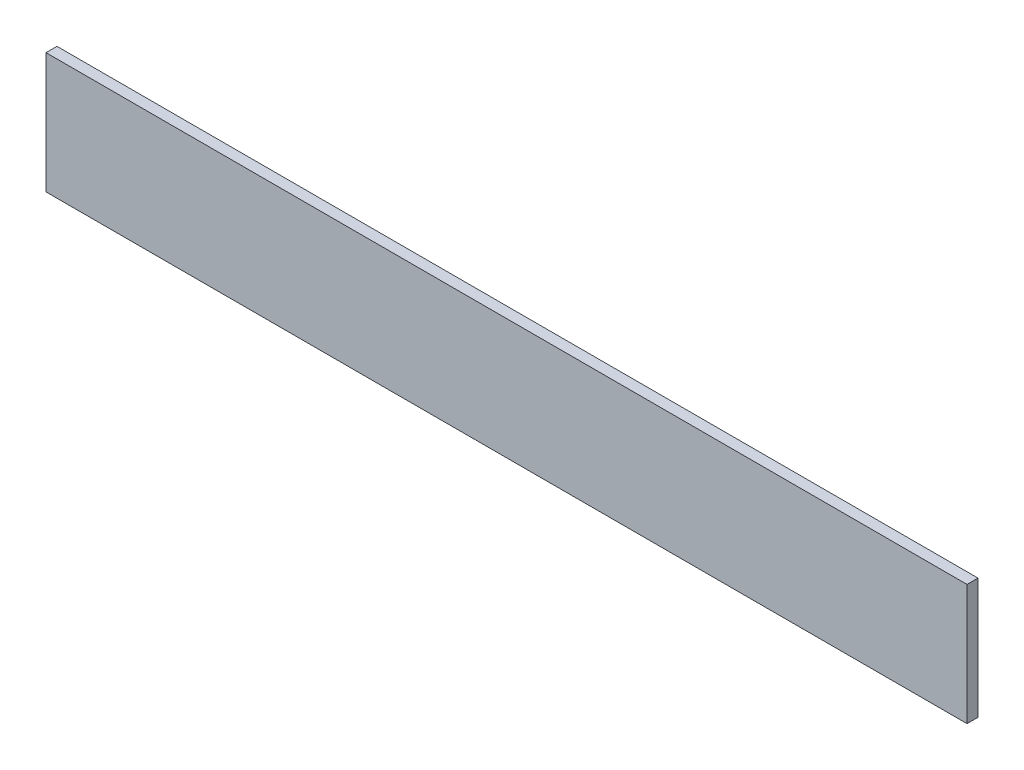
ISO-10303-21;
HEADER;
FILE_DESCRIPTION(('STEP AP214'),'2;1');
FILE_NAME('part.step','',(''),(''),'','','');
FILE_SCHEMA(('AUTOMOTIVE_DESIGN { 1 0 10303 214 1 1 1 1 }'));
ENDSEC;
DATA;
#1=APPLICATION_CONTEXT('core data for automotive mechanical design processes');
#2=APPLICATION_PROTOCOL_DEFINITION('international standard','automotive_design',2000,#1);
#3=PRODUCT_CONTEXT('',#1,'mechanical');
#4=PRODUCT('Part','Part','',(#3));
#5=PRODUCT_RELATED_PRODUCT_CATEGORY('part','',(#4));
#6=PRODUCT_DEFINITION_FORMATION('','',#4);
#7=PRODUCT_DEFINITION_CONTEXT('part definition',#1,'design');
#8=PRODUCT_DEFINITION('design','',#6,#7);
#9=PRODUCT_DEFINITION_SHAPE('','',#8);
#10=(LENGTH_UNIT() NAMED_UNIT(*) SI_UNIT(.MILLI.,.METRE.));
#11=(NAMED_UNIT(*) PLANE_ANGLE_UNIT() SI_UNIT($,.RADIAN.));
#12=(NAMED_UNIT(*) SI_UNIT($,.STERADIAN.) SOLID_ANGLE_UNIT());
#13=UNCERTAINTY_MEASURE_WITH_UNIT(LENGTH_MEASURE(1.E-05),#10,'distance_accuracy_value','');
#14=(GEOMETRIC_REPRESENTATION_CONTEXT(3) GLOBAL_UNCERTAINTY_ASSIGNED_CONTEXT((#13)) GLOBAL_UNIT_ASSIGNED_CONTEXT((#10,
#11,#12)) REPRESENTATION_CONTEXT('',''));
#15=CARTESIAN_POINT('',(0.,0.,0.));
#16=DIRECTION('',(0.,0.,1.));
#17=DIRECTION('',(1.,0.,0.));
#18=AXIS2_PLACEMENT_3D('',#15,#16,#17);
#19=CARTESIAN_POINT('',(210.,27.5,5.));
#20=DIRECTION('',(-1.,0.,0.));
#21=DIRECTION('',(0.,0.,1.));
#22=AXIS2_PLACEMENT_3D('',#19,#20,#21);
#23=PLANE('',#22);
#24=DIRECTION('',(0.,1.,0.));
#25=VECTOR('',#24,1.);
#26=CARTESIAN_POINT('',(210.,27.5,0.));
#27=LINE('',#26,#25);
#28=CARTESIAN_POINT('',(210.,-27.5,0.));
#29=VERTEX_POINT('',#28);
#30=CARTESIAN_POINT('',(210.,27.5,0.));
#31=VERTEX_POINT('',#30);
#32=EDGE_CURVE('E107',#29,#31,#27,.T.);
#33=ORIENTED_EDGE('',*,*,#32,.T.);
#34=DIRECTION('',(0.,0.,-1.));
#35=VECTOR('',#34,1.);
#36=CARTESIAN_POINT('',(210.,27.5,5.));
#37=LINE('',#36,#35);
#38=CARTESIAN_POINT('',(210.,27.5,5.));
#39=VERTEX_POINT('',#38);
#40=EDGE_CURVE('E11',#39,#31,#37,.T.);
#41=ORIENTED_EDGE('',*,*,#40,.F.);
#42=DIRECTION('',(0.,1.,0.));
#43=VECTOR('',#42,1.);
#44=CARTESIAN_POINT('',(210.,27.5,5.));
#45=LINE('',#44,#43);
#46=CARTESIAN_POINT('',(210.,-27.5,5.));
#47=VERTEX_POINT('',#46);
#48=EDGE_CURVE('E91',#47,#39,#45,.T.);
#49=ORIENTED_EDGE('',*,*,#48,.F.);
#50=DIRECTION('',(0.,0.,-1.));
#51=VECTOR('',#50,1.);
#52=CARTESIAN_POINT('',(210.,-27.5,5.));
#53=LINE('',#52,#51);
#54=EDGE_CURVE('E103',#47,#29,#53,.T.);
#55=ORIENTED_EDGE('',*,*,#54,.T.);
#56=EDGE_LOOP('',(#33,#41,#49,#55));
#57=FACE_BOUND('',#56,.T.);
#58=ADVANCED_FACE('F39',(#57),#23,.F.);
#59=CARTESIAN_POINT('',(-210.,27.5,5.));
#60=DIRECTION('',(0.,-1.,0.));
#61=DIRECTION('',(0.,0.,-1.));
#62=AXIS2_PLACEMENT_3D('',#59,#60,#61);
#63=PLANE('',#62);
#64=DIRECTION('',(-1.,0.,0.));
#65=VECTOR('',#64,1.);
#66=CARTESIAN_POINT('',(-210.,27.5,0.));
#67=LINE('',#66,#65);
#68=CARTESIAN_POINT('',(-210.,27.5,0.));
#69=VERTEX_POINT('',#68);
#70=EDGE_CURVE('E96',#31,#69,#67,.T.);
#71=ORIENTED_EDGE('',*,*,#70,.T.);
#72=DIRECTION('',(0.,0.,-1.));
#73=VECTOR('',#72,1.);
#74=CARTESIAN_POINT('',(-210.,27.5,5.));
#75=LINE('',#74,#73);
#76=CARTESIAN_POINT('',(-210.,27.5,5.));
#77=VERTEX_POINT('',#76);
#78=EDGE_CURVE('E48',#77,#69,#75,.T.);
#79=ORIENTED_EDGE('',*,*,#78,.F.);
#80=DIRECTION('',(-1.,0.,0.));
#81=VECTOR('',#80,1.);
#82=CARTESIAN_POINT('',(-210.,27.5,5.));
#83=LINE('',#82,#81);
#84=EDGE_CURVE('E86',#39,#77,#83,.T.);
#85=ORIENTED_EDGE('',*,*,#84,.F.);
#86=ORIENTED_EDGE('',*,*,#40,.T.);
#87=EDGE_LOOP('',(#71,#79,#85,#86));
#88=FACE_BOUND('',#87,.T.);
#89=ADVANCED_FACE('F95',(#88),#63,.F.);
#90=CARTESIAN_POINT('',(-210.,27.5,5.));
#91=DIRECTION('',(1.,0.,0.));
#92=DIRECTION('',(0.,0.,-1.));
#93=AXIS2_PLACEMENT_3D('',#90,#91,#92);
#94=PLANE('',#93);
#95=DIRECTION('',(0.,-1.,0.));
#96=VECTOR('',#95,1.);
#97=CARTESIAN_POINT('',(-210.,27.5,0.));
#98=LINE('',#97,#96);
#99=CARTESIAN_POINT('',(-210.,-27.5,0.));
#100=VERTEX_POINT('',#99);
#101=EDGE_CURVE('E73',#69,#100,#98,.T.);
#102=ORIENTED_EDGE('',*,*,#101,.T.);
#103=DIRECTION('',(0.,0.,-1.));
#104=VECTOR('',#103,1.);
#105=CARTESIAN_POINT('',(-210.,-27.5,5.));
#106=LINE('',#105,#104);
#107=CARTESIAN_POINT('',(-210.,-27.5,5.));
#108=VERTEX_POINT('',#107);
#109=EDGE_CURVE('E98',#108,#100,#106,.T.);
#110=ORIENTED_EDGE('',*,*,#109,.F.);
#111=DIRECTION('',(0.,-1.,0.));
#112=VECTOR('',#111,1.);
#113=CARTESIAN_POINT('',(-210.,27.5,5.));
#114=LINE('',#113,#112);
#115=EDGE_CURVE('E89',#77,#108,#114,.T.);
#116=ORIENTED_EDGE('',*,*,#115,.F.);
#117=ORIENTED_EDGE('',*,*,#78,.T.);
#118=EDGE_LOOP('',(#102,#110,#116,#117));
#119=FACE_BOUND('',#118,.T.);
#120=ADVANCED_FACE('F99',(#119),#94,.F.);
#121=CARTESIAN_POINT('',(-210.,-27.5,5.));
#122=DIRECTION('',(0.,1.,0.));
#123=DIRECTION('',(0.,0.,1.));
#124=AXIS2_PLACEMENT_3D('',#121,#122,#123);
#125=PLANE('',#124);
#126=DIRECTION('',(1.,0.,0.));
#127=VECTOR('',#126,1.);
#128=CARTESIAN_POINT('',(-210.,-27.5,0.));
#129=LINE('',#128,#127);
#130=EDGE_CURVE('E79',#100,#29,#129,.T.);
#131=ORIENTED_EDGE('',*,*,#130,.T.);
#132=ORIENTED_EDGE('',*,*,#54,.F.);
#133=DIRECTION('',(1.,0.,0.));
#134=VECTOR('',#133,1.);
#135=CARTESIAN_POINT('',(-210.,-27.5,5.));
#136=LINE('',#135,#134);
#137=EDGE_CURVE('E56',#108,#47,#136,.T.);
#138=ORIENTED_EDGE('',*,*,#137,.F.);
#139=ORIENTED_EDGE('',*,*,#109,.T.);
#140=EDGE_LOOP('',(#131,#132,#138,#139));
#141=FACE_BOUND('',#140,.T.);
#142=ADVANCED_FACE('F120',(#141),#125,.F.);
#143=CARTESIAN_POINT('',(0.,0.,5.));
#144=DIRECTION('',(0.,0.,1.));
#145=DIRECTION('',(1.,0.,0.));
#146=AXIS2_PLACEMENT_3D('',#143,#144,#145);
#147=PLANE('',#146);
#148=ORIENTED_EDGE('',*,*,#48,.T.);
#149=ORIENTED_EDGE('',*,*,#84,.T.);
#150=ORIENTED_EDGE('',*,*,#115,.T.);
#151=ORIENTED_EDGE('',*,*,#137,.T.);
#152=EDGE_LOOP('',(#148,#149,#150,#151));
#153=FACE_BOUND('',#152,.T.);
#154=ADVANCED_FACE('F87',(#153),#147,.T.);
#155=CARTESIAN_POINT('',(0.,0.,0.));
#156=DIRECTION('',(0.,0.,1.));
#157=DIRECTION('',(1.,0.,0.));
#158=AXIS2_PLACEMENT_3D('',#155,#156,#157);
#159=PLANE('',#158);
#160=ORIENTED_EDGE('',*,*,#32,.F.);
#161=ORIENTED_EDGE('',*,*,#130,.F.);
#162=ORIENTED_EDGE('',*,*,#101,.F.);
#163=ORIENTED_EDGE('',*,*,#70,.F.);
#164=EDGE_LOOP('',(#160,#161,#162,#163));
#165=FACE_BOUND('',#164,.T.);
#166=ADVANCED_FACE('F123',(#165),#159,.F.);
#167=CLOSED_SHELL('',(#58,#89,#120,#142,#154,#166));
#168=MANIFOLD_SOLID_BREP('B2',#167);
#169=ADVANCED_BREP_SHAPE_REPRESENTATION('',(#18,#168),#14);
#170=SHAPE_DEFINITION_REPRESENTATION(#9,#169);
ENDSEC;
END-ISO-10303-21;
